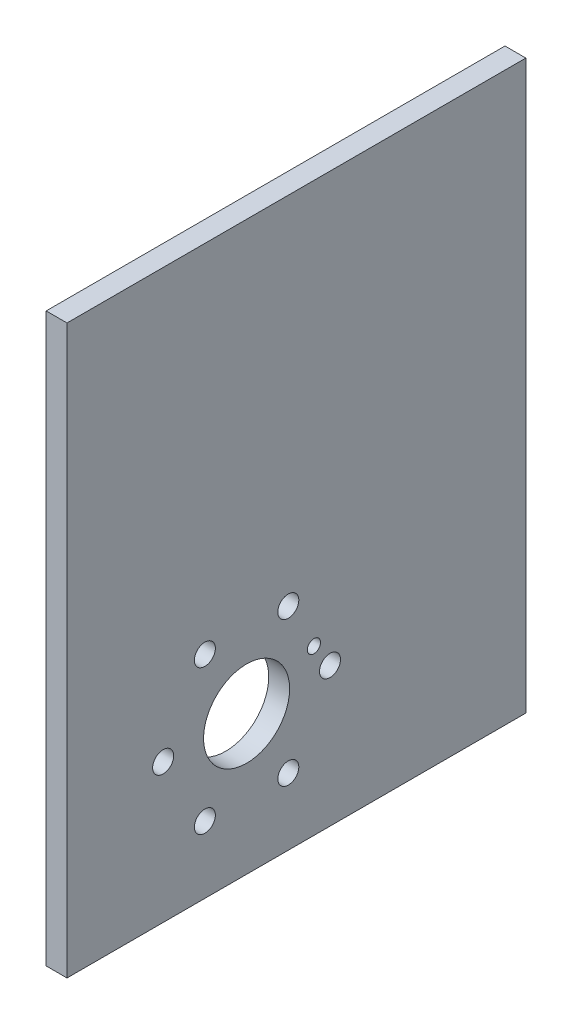
ISO-10303-21;
HEADER;
FILE_DESCRIPTION(('STEP AP214'),'2;1');
FILE_NAME('part.step','',(''),(''),'','','');
FILE_SCHEMA(('AUTOMOTIVE_DESIGN { 1 0 10303 214 1 1 1 1 }'));
ENDSEC;
DATA;
#1=APPLICATION_CONTEXT('core data for automotive mechanical design processes');
#2=APPLICATION_PROTOCOL_DEFINITION('international standard','automotive_design',2000,#1);
#3=PRODUCT_CONTEXT('',#1,'mechanical');
#4=PRODUCT('Part','Part','',(#3));
#5=PRODUCT_RELATED_PRODUCT_CATEGORY('part','',(#4));
#6=PRODUCT_DEFINITION_FORMATION('','',#4);
#7=PRODUCT_DEFINITION_CONTEXT('part definition',#1,'design');
#8=PRODUCT_DEFINITION('design','',#6,#7);
#9=PRODUCT_DEFINITION_SHAPE('','',#8);
#10=(LENGTH_UNIT() NAMED_UNIT(*) SI_UNIT(.MILLI.,.METRE.));
#11=(NAMED_UNIT(*) PLANE_ANGLE_UNIT() SI_UNIT($,.RADIAN.));
#12=(NAMED_UNIT(*) SI_UNIT($,.STERADIAN.) SOLID_ANGLE_UNIT());
#13=UNCERTAINTY_MEASURE_WITH_UNIT(LENGTH_MEASURE(1.E-05),#10,'distance_accuracy_value','');
#14=(GEOMETRIC_REPRESENTATION_CONTEXT(3) GLOBAL_UNCERTAINTY_ASSIGNED_CONTEXT((#13)) GLOBAL_UNIT_ASSIGNED_CONTEXT((#10,
#11,#12)) REPRESENTATION_CONTEXT('',''));
#15=CARTESIAN_POINT('',(0.,0.,0.));
#16=DIRECTION('',(0.,0.,1.));
#17=DIRECTION('',(1.,0.,0.));
#18=AXIS2_PLACEMENT_3D('',#15,#16,#17);
#19=CARTESIAN_POINT('',(3.175,0.,0.));
#20=DIRECTION('',(0.,0.,-1.));
#21=DIRECTION('',(-1.,0.,0.));
#22=AXIS2_PLACEMENT_3D('',#19,#20,#21);
#23=PLANE('',#22);
#24=DIRECTION('',(0.,-1.,0.));
#25=VECTOR('',#24,1.);
#26=CARTESIAN_POINT('',(0.,0.,0.));
#27=LINE('',#26,#25);
#28=CARTESIAN_POINT('',(0.,86.36,0.));
#29=VERTEX_POINT('',#28);
#30=CARTESIAN_POINT('',(0.,0.,0.));
#31=VERTEX_POINT('',#30);
#32=EDGE_CURVE('E96',#29,#31,#27,.T.);
#33=ORIENTED_EDGE('',*,*,#32,.T.);
#34=DIRECTION('',(-1.,0.,0.));
#35=VECTOR('',#34,1.);
#36=CARTESIAN_POINT('',(3.175,0.,0.));
#37=LINE('',#36,#35);
#38=CARTESIAN_POINT('',(3.175,0.,0.));
#39=VERTEX_POINT('',#38);
#40=EDGE_CURVE('E11',#39,#31,#37,.T.);
#41=ORIENTED_EDGE('',*,*,#40,.F.);
#42=DIRECTION('',(0.,-1.,0.));
#43=VECTOR('',#42,1.);
#44=CARTESIAN_POINT('',(3.175,0.,0.));
#45=LINE('',#44,#43);
#46=CARTESIAN_POINT('',(3.175,86.36,0.));
#47=VERTEX_POINT('',#46);
#48=EDGE_CURVE('E84',#47,#39,#45,.T.);
#49=ORIENTED_EDGE('',*,*,#48,.F.);
#50=DIRECTION('',(-1.,0.,0.));
#51=VECTOR('',#50,1.);
#52=CARTESIAN_POINT('',(3.175,86.36,0.));
#53=LINE('',#52,#51);
#54=EDGE_CURVE('E92',#47,#29,#53,.T.);
#55=ORIENTED_EDGE('',*,*,#54,.T.);
#56=EDGE_LOOP('',(#33,#41,#49,#55));
#57=FACE_BOUND('',#56,.T.);
#58=ADVANCED_FACE('F33',(#57),#23,.F.);
#59=CARTESIAN_POINT('',(3.175,0.,0.));
#60=DIRECTION('',(0.,1.,0.));
#61=DIRECTION('',(0.,0.,1.));
#62=AXIS2_PLACEMENT_3D('',#59,#60,#61);
#63=PLANE('',#62);
#64=DIRECTION('',(0.,0.,-1.));
#65=VECTOR('',#64,1.);
#66=CARTESIAN_POINT('',(0.,0.,0.));
#67=LINE('',#66,#65);
#68=CARTESIAN_POINT('',(0.,0.,-69.85));
#69=VERTEX_POINT('',#68);
#70=EDGE_CURVE('E88',#31,#69,#67,.T.);
#71=ORIENTED_EDGE('',*,*,#70,.T.);
#72=DIRECTION('',(-1.,0.,0.));
#73=VECTOR('',#72,1.);
#74=CARTESIAN_POINT('',(3.175,0.,-69.85));
#75=LINE('',#74,#73);
#76=CARTESIAN_POINT('',(3.175,0.,-69.85));
#77=VERTEX_POINT('',#76);
#78=EDGE_CURVE('E41',#77,#69,#75,.T.);
#79=ORIENTED_EDGE('',*,*,#78,.F.);
#80=DIRECTION('',(0.,0.,-1.));
#81=VECTOR('',#80,1.);
#82=CARTESIAN_POINT('',(3.175,0.,0.));
#83=LINE('',#82,#81);
#84=EDGE_CURVE('E79',#39,#77,#83,.T.);
#85=ORIENTED_EDGE('',*,*,#84,.F.);
#86=ORIENTED_EDGE('',*,*,#40,.T.);
#87=EDGE_LOOP('',(#71,#79,#85,#86));
#88=FACE_BOUND('',#87,.T.);
#89=ADVANCED_FACE('F87',(#88),#63,.F.);
#90=CARTESIAN_POINT('',(3.175,0.,-69.85));
#91=DIRECTION('',(0.,0.,1.));
#92=DIRECTION('',(1.,0.,0.));
#93=AXIS2_PLACEMENT_3D('',#90,#91,#92);
#94=PLANE('',#93);
#95=DIRECTION('',(0.,1.,0.));
#96=VECTOR('',#95,1.);
#97=CARTESIAN_POINT('',(0.,0.,-69.85));
#98=LINE('',#97,#96);
#99=CARTESIAN_POINT('',(0.,86.36,-69.85));
#100=VERTEX_POINT('',#99);
#101=EDGE_CURVE('E66',#69,#100,#98,.T.);
#102=ORIENTED_EDGE('',*,*,#101,.T.);
#103=DIRECTION('',(-1.,0.,0.));
#104=VECTOR('',#103,1.);
#105=CARTESIAN_POINT('',(3.175,86.36,-69.85));
#106=LINE('',#105,#104);
#107=CARTESIAN_POINT('',(3.175,86.36,-69.85));
#108=VERTEX_POINT('',#107);
#109=EDGE_CURVE('E89',#108,#100,#106,.T.);
#110=ORIENTED_EDGE('',*,*,#109,.F.);
#111=DIRECTION('',(0.,1.,0.));
#112=VECTOR('',#111,1.);
#113=CARTESIAN_POINT('',(3.175,0.,-69.85));
#114=LINE('',#113,#112);
#115=EDGE_CURVE('E82',#77,#108,#114,.T.);
#116=ORIENTED_EDGE('',*,*,#115,.F.);
#117=ORIENTED_EDGE('',*,*,#78,.T.);
#118=EDGE_LOOP('',(#102,#110,#116,#117));
#119=FACE_BOUND('',#118,.T.);
#120=ADVANCED_FACE('F90',(#119),#94,.F.);
#121=CARTESIAN_POINT('',(3.175,86.36,0.));
#122=DIRECTION('',(0.,-1.,0.));
#123=DIRECTION('',(0.,0.,-1.));
#124=AXIS2_PLACEMENT_3D('',#121,#122,#123);
#125=PLANE('',#124);
#126=DIRECTION('',(0.,0.,1.));
#127=VECTOR('',#126,1.);
#128=CARTESIAN_POINT('',(0.,86.36,0.));
#129=LINE('',#128,#127);
#130=EDGE_CURVE('E72',#100,#29,#129,.T.);
#131=ORIENTED_EDGE('',*,*,#130,.T.);
#132=ORIENTED_EDGE('',*,*,#54,.F.);
#133=DIRECTION('',(0.,0.,1.));
#134=VECTOR('',#133,1.);
#135=CARTESIAN_POINT('',(3.175,86.36,0.));
#136=LINE('',#135,#134);
#137=EDGE_CURVE('E49',#108,#47,#136,.T.);
#138=ORIENTED_EDGE('',*,*,#137,.F.);
#139=ORIENTED_EDGE('',*,*,#109,.T.);
#140=EDGE_LOOP('',(#131,#132,#138,#139));
#141=FACE_BOUND('',#140,.T.);
#142=ADVANCED_FACE('F104',(#141),#125,.F.);
#143=CARTESIAN_POINT('',(3.175,0.,0.));
#144=DIRECTION('',(-1.,0.,0.));
#145=DIRECTION('',(0.,0.,1.));
#146=AXIS2_PLACEMENT_3D('',#143,#144,#145);
#147=PLANE('',#146);
#148=CARTESIAN_POINT('',(3.175,24.95127344,-37.59058776));
#149=DIRECTION('',(1.,0.,0.));
#150=DIRECTION('',(0.,0.,-1.));
#151=AXIS2_PLACEMENT_3D('',#148,#149,#150);
#152=CIRCLE('',#151,0.999999999999997);
#153=CARTESIAN_POINT('',(3.175,24.95127344,-38.59058776));
#154=VERTEX_POINT('',#153);
#155=EDGE_CURVE('E154',#154,#154,#152,.T.);
#156=ORIENTED_EDGE('',*,*,#155,.F.);
#157=EDGE_LOOP('',(#156));
#158=FACE_BOUND('',#157,.T.);
#159=CARTESIAN_POINT('',(3.175,21.18693756,-40.03778886));
#160=DIRECTION('',(-1.,0.,0.));
#161=DIRECTION('',(0.,0.,1.));
#162=AXIS2_PLACEMENT_3D('',#159,#160,#161);
#163=CIRCLE('',#162,1.6);
#164=CARTESIAN_POINT('',(3.175,21.18693756,-38.43778886));
#165=VERTEX_POINT('',#164);
#166=EDGE_CURVE('E145',#165,#165,#163,.T.);
#167=ORIENTED_EDGE('',*,*,#166,.T.);
#168=EDGE_LOOP('',(#167));
#169=FACE_BOUND('',#168,.T.);
#170=CARTESIAN_POINT('',(3.175,32.1854601880624,-33.68778886));
#171=DIRECTION('',(-1.,0.,0.));
#172=DIRECTION('',(0.,0.,1.));
#173=AXIS2_PLACEMENT_3D('',#170,#171,#172);
#174=CIRCLE('',#173,1.59999999999999);
#175=CARTESIAN_POINT('',(3.175,32.1854601880624,-32.08778886));
#176=VERTEX_POINT('',#175);
#177=EDGE_CURVE('E139',#176,#176,#174,.T.);
#178=ORIENTED_EDGE('',*,*,#177,.T.);
#179=EDGE_LOOP('',(#178));
#180=FACE_BOUND('',#179,.T.);
#181=CARTESIAN_POINT('',(3.175,32.1854601880624,-20.98778886));
#182=DIRECTION('',(-1.,0.,0.));
#183=DIRECTION('',(0.,0.,1.));
#184=AXIS2_PLACEMENT_3D('',#181,#182,#183);
#185=CIRCLE('',#184,1.6);
#186=CARTESIAN_POINT('',(3.175,32.1854601880624,-19.38778886));
#187=VERTEX_POINT('',#186);
#188=EDGE_CURVE('E133',#187,#187,#185,.T.);
#189=ORIENTED_EDGE('',*,*,#188,.T.);
#190=EDGE_LOOP('',(#189));
#191=FACE_BOUND('',#190,.T.);
#192=CARTESIAN_POINT('',(3.175,21.1869375599999,-14.63778886));
#193=DIRECTION('',(-1.,0.,0.));
#194=DIRECTION('',(0.,0.,1.));
#195=AXIS2_PLACEMENT_3D('',#192,#193,#194);
#196=CIRCLE('',#195,1.6);
#197=CARTESIAN_POINT('',(3.175,21.1869375599999,-13.03778886));
#198=VERTEX_POINT('',#197);
#199=EDGE_CURVE('E127',#198,#198,#196,.T.);
#200=ORIENTED_EDGE('',*,*,#199,.T.);
#201=EDGE_LOOP('',(#200));
#202=FACE_BOUND('',#201,.T.);
#203=CARTESIAN_POINT('',(3.175,10.1884149319376,-20.9877888600001));
#204=DIRECTION('',(-1.,0.,0.));
#205=DIRECTION('',(0.,0.,1.));
#206=AXIS2_PLACEMENT_3D('',#203,#204,#205);
#207=CIRCLE('',#206,1.6);
#208=CARTESIAN_POINT('',(3.175,10.1884149319376,-19.3877888600001));
#209=VERTEX_POINT('',#208);
#210=EDGE_CURVE('E121',#209,#209,#207,.T.);
#211=ORIENTED_EDGE('',*,*,#210,.T.);
#212=EDGE_LOOP('',(#211));
#213=FACE_BOUND('',#212,.T.);
#214=CARTESIAN_POINT('',(3.175,10.1884149319377,-33.6877888600001));
#215=DIRECTION('',(-1.,0.,0.));
#216=DIRECTION('',(0.,0.,1.));
#217=AXIS2_PLACEMENT_3D('',#214,#215,#216);
#218=CIRCLE('',#217,1.6);
#219=CARTESIAN_POINT('',(3.175,10.1884149319377,-32.0877888600001));
#220=VERTEX_POINT('',#219);
#221=EDGE_CURVE('E115',#220,#220,#218,.T.);
#222=ORIENTED_EDGE('',*,*,#221,.T.);
#223=EDGE_LOOP('',(#222));
#224=FACE_BOUND('',#223,.T.);
#225=CARTESIAN_POINT('',(3.175,21.18693756,-27.33778886));
#226=DIRECTION('',(1.,0.,0.));
#227=DIRECTION('',(0.,0.,-1.));
#228=AXIS2_PLACEMENT_3D('',#225,#226,#227);
#229=CIRCLE('',#228,6.54812);
#230=CARTESIAN_POINT('',(3.175,21.18693756,-33.88590886));
#231=VERTEX_POINT('',#230);
#232=EDGE_CURVE('E112',#231,#231,#229,.T.);
#233=ORIENTED_EDGE('',*,*,#232,.F.);
#234=EDGE_LOOP('',(#233));
#235=FACE_BOUND('',#234,.T.);
#236=ORIENTED_EDGE('',*,*,#48,.T.);
#237=ORIENTED_EDGE('',*,*,#84,.T.);
#238=ORIENTED_EDGE('',*,*,#115,.T.);
#239=ORIENTED_EDGE('',*,*,#137,.T.);
#240=EDGE_LOOP('',(#236,#237,#238,#239));
#241=FACE_BOUND('',#240,.T.);
#242=ADVANCED_FACE('F80',(#158,#169,#180,#191,#202,#213,#224,#235,#241),#147,.F.);
#243=CARTESIAN_POINT('',(0.,0.,0.));
#244=DIRECTION('',(-1.,0.,0.));
#245=DIRECTION('',(0.,0.,1.));
#246=AXIS2_PLACEMENT_3D('',#243,#244,#245);
#247=PLANE('',#246);
#248=CARTESIAN_POINT('',(0.,24.95127344,-37.59058776));
#249=DIRECTION('',(-1.,0.,0.));
#250=DIRECTION('',(0.,0.,1.));
#251=AXIS2_PLACEMENT_3D('',#248,#249,#250);
#252=CIRCLE('',#251,0.999999999999996);
#253=CARTESIAN_POINT('',(0.,24.95127344,-36.59058776));
#254=VERTEX_POINT('',#253);
#255=EDGE_CURVE('E151',#254,#254,#252,.T.);
#256=ORIENTED_EDGE('',*,*,#255,.F.);
#257=EDGE_LOOP('',(#256));
#258=FACE_BOUND('',#257,.T.);
#259=CARTESIAN_POINT('',(0.,21.18693756,-40.03778886));
#260=DIRECTION('',(-1.,0.,0.));
#261=DIRECTION('',(0.,0.,1.));
#262=AXIS2_PLACEMENT_3D('',#259,#260,#261);
#263=CIRCLE('',#262,1.6);
#264=CARTESIAN_POINT('',(0.,21.18693756,-38.43778886));
#265=VERTEX_POINT('',#264);
#266=EDGE_CURVE('E148',#265,#265,#263,.T.);
#267=ORIENTED_EDGE('',*,*,#266,.F.);
#268=EDGE_LOOP('',(#267));
#269=FACE_BOUND('',#268,.T.);
#270=CARTESIAN_POINT('',(0.,32.1854601880624,-33.68778886));
#271=DIRECTION('',(-1.,0.,0.));
#272=DIRECTION('',(0.,0.,1.));
#273=AXIS2_PLACEMENT_3D('',#270,#271,#272);
#274=CIRCLE('',#273,1.6);
#275=CARTESIAN_POINT('',(0.,32.1854601880624,-32.08778886));
#276=VERTEX_POINT('',#275);
#277=EDGE_CURVE('E142',#276,#276,#274,.T.);
#278=ORIENTED_EDGE('',*,*,#277,.F.);
#279=EDGE_LOOP('',(#278));
#280=FACE_BOUND('',#279,.T.);
#281=CARTESIAN_POINT('',(0.,32.1854601880624,-20.98778886));
#282=DIRECTION('',(-1.,0.,0.));
#283=DIRECTION('',(0.,0.,1.));
#284=AXIS2_PLACEMENT_3D('',#281,#282,#283);
#285=CIRCLE('',#284,1.6);
#286=CARTESIAN_POINT('',(0.,32.1854601880624,-19.38778886));
#287=VERTEX_POINT('',#286);
#288=EDGE_CURVE('E136',#287,#287,#285,.T.);
#289=ORIENTED_EDGE('',*,*,#288,.F.);
#290=EDGE_LOOP('',(#289));
#291=FACE_BOUND('',#290,.T.);
#292=CARTESIAN_POINT('',(0.,21.1869375599999,-14.63778886));
#293=DIRECTION('',(-1.,0.,0.));
#294=DIRECTION('',(0.,0.,1.));
#295=AXIS2_PLACEMENT_3D('',#292,#293,#294);
#296=CIRCLE('',#295,1.6);
#297=CARTESIAN_POINT('',(0.,21.1869375599999,-13.03778886));
#298=VERTEX_POINT('',#297);
#299=EDGE_CURVE('E130',#298,#298,#296,.T.);
#300=ORIENTED_EDGE('',*,*,#299,.F.);
#301=EDGE_LOOP('',(#300));
#302=FACE_BOUND('',#301,.T.);
#303=CARTESIAN_POINT('',(0.,10.1884149319376,-20.9877888600001));
#304=DIRECTION('',(-1.,0.,0.));
#305=DIRECTION('',(0.,0.,1.));
#306=AXIS2_PLACEMENT_3D('',#303,#304,#305);
#307=CIRCLE('',#306,1.6);
#308=CARTESIAN_POINT('',(0.,10.1884149319376,-19.3877888600001));
#309=VERTEX_POINT('',#308);
#310=EDGE_CURVE('E124',#309,#309,#307,.T.);
#311=ORIENTED_EDGE('',*,*,#310,.F.);
#312=EDGE_LOOP('',(#311));
#313=FACE_BOUND('',#312,.T.);
#314=CARTESIAN_POINT('',(0.,10.1884149319377,-33.6877888600001));
#315=DIRECTION('',(-1.,0.,0.));
#316=DIRECTION('',(0.,0.,1.));
#317=AXIS2_PLACEMENT_3D('',#314,#315,#316);
#318=CIRCLE('',#317,1.6);
#319=CARTESIAN_POINT('',(0.,10.1884149319377,-32.0877888600001));
#320=VERTEX_POINT('',#319);
#321=EDGE_CURVE('E118',#320,#320,#318,.T.);
#322=ORIENTED_EDGE('',*,*,#321,.F.);
#323=EDGE_LOOP('',(#322));
#324=FACE_BOUND('',#323,.T.);
#325=CARTESIAN_POINT('',(0.,21.18693756,-27.33778886));
#326=DIRECTION('',(-1.,0.,0.));
#327=DIRECTION('',(0.,0.,1.));
#328=AXIS2_PLACEMENT_3D('',#325,#326,#327);
#329=CIRCLE('',#328,6.54812);
#330=CARTESIAN_POINT('',(0.,21.18693756,-20.78966886));
#331=VERTEX_POINT('',#330);
#332=EDGE_CURVE('E99',#331,#331,#329,.T.);
#333=ORIENTED_EDGE('',*,*,#332,.F.);
#334=EDGE_LOOP('',(#333));
#335=FACE_BOUND('',#334,.T.);
#336=ORIENTED_EDGE('',*,*,#32,.F.);
#337=ORIENTED_EDGE('',*,*,#130,.F.);
#338=ORIENTED_EDGE('',*,*,#101,.F.);
#339=ORIENTED_EDGE('',*,*,#70,.F.);
#340=EDGE_LOOP('',(#336,#337,#338,#339));
#341=FACE_BOUND('',#340,.T.);
#342=ADVANCED_FACE('F107',(#258,#269,#280,#291,#302,#313,#324,#335,#341),#247,.T.);
#343=CARTESIAN_POINT('',(3.175,21.18693756,-27.33778886));
#344=DIRECTION('',(1.,0.,0.));
#345=DIRECTION('',(0.,0.,-1.));
#346=AXIS2_PLACEMENT_3D('',#343,#344,#345);
#347=CYLINDRICAL_SURFACE('',#346,6.54812);
#348=ORIENTED_EDGE('',*,*,#332,.T.);
#349=EDGE_LOOP('',(#348));
#350=FACE_BOUND('',#349,.T.);
#351=ORIENTED_EDGE('',*,*,#232,.T.);
#352=EDGE_LOOP('',(#351));
#353=FACE_BOUND('',#352,.T.);
#354=ADVANCED_FACE('F177',(#350,#353),#347,.F.);
#355=CARTESIAN_POINT('',(0.,10.1884149319377,-33.6877888600001));
#356=DIRECTION('',(-1.,0.,0.));
#357=DIRECTION('',(0.,0.,1.));
#358=AXIS2_PLACEMENT_3D('',#355,#356,#357);
#359=CYLINDRICAL_SURFACE('',#358,1.6);
#360=ORIENTED_EDGE('',*,*,#321,.T.);
#361=EDGE_LOOP('',(#360));
#362=FACE_BOUND('',#361,.T.);
#363=ORIENTED_EDGE('',*,*,#221,.F.);
#364=EDGE_LOOP('',(#363));
#365=FACE_BOUND('',#364,.T.);
#366=ADVANCED_FACE('F179',(#362,#365),#359,.F.);
#367=CARTESIAN_POINT('',(0.,10.1884149319376,-20.9877888600001));
#368=DIRECTION('',(-1.,0.,0.));
#369=DIRECTION('',(0.,0.,1.));
#370=AXIS2_PLACEMENT_3D('',#367,#368,#369);
#371=CYLINDRICAL_SURFACE('',#370,1.6);
#372=ORIENTED_EDGE('',*,*,#310,.T.);
#373=EDGE_LOOP('',(#372));
#374=FACE_BOUND('',#373,.T.);
#375=ORIENTED_EDGE('',*,*,#210,.F.);
#376=EDGE_LOOP('',(#375));
#377=FACE_BOUND('',#376,.T.);
#378=ADVANCED_FACE('F186',(#374,#377),#371,.F.);
#379=CARTESIAN_POINT('',(0.,21.1869375599999,-14.63778886));
#380=DIRECTION('',(-1.,0.,0.));
#381=DIRECTION('',(0.,0.,1.));
#382=AXIS2_PLACEMENT_3D('',#379,#380,#381);
#383=CYLINDRICAL_SURFACE('',#382,1.6);
#384=ORIENTED_EDGE('',*,*,#299,.T.);
#385=EDGE_LOOP('',(#384));
#386=FACE_BOUND('',#385,.T.);
#387=ORIENTED_EDGE('',*,*,#199,.F.);
#388=EDGE_LOOP('',(#387));
#389=FACE_BOUND('',#388,.T.);
#390=ADVANCED_FACE('F248',(#386,#389),#383,.F.);
#391=CARTESIAN_POINT('',(0.,32.1854601880624,-20.98778886));
#392=DIRECTION('',(-1.,0.,0.));
#393=DIRECTION('',(0.,0.,1.));
#394=AXIS2_PLACEMENT_3D('',#391,#392,#393);
#395=CYLINDRICAL_SURFACE('',#394,1.6);
#396=ORIENTED_EDGE('',*,*,#288,.T.);
#397=EDGE_LOOP('',(#396));
#398=FACE_BOUND('',#397,.T.);
#399=ORIENTED_EDGE('',*,*,#188,.F.);
#400=EDGE_LOOP('',(#399));
#401=FACE_BOUND('',#400,.T.);
#402=ADVANCED_FACE('F240',(#398,#401),#395,.F.);
#403=CARTESIAN_POINT('',(0.,32.1854601880624,-33.68778886));
#404=DIRECTION('',(-1.,0.,0.));
#405=DIRECTION('',(0.,0.,1.));
#406=AXIS2_PLACEMENT_3D('',#403,#404,#405);
#407=CYLINDRICAL_SURFACE('',#406,1.59999999999999);
#408=ORIENTED_EDGE('',*,*,#277,.T.);
#409=EDGE_LOOP('',(#408));
#410=FACE_BOUND('',#409,.T.);
#411=ORIENTED_EDGE('',*,*,#177,.F.);
#412=EDGE_LOOP('',(#411));
#413=FACE_BOUND('',#412,.T.);
#414=ADVANCED_FACE('F233',(#410,#413),#407,.F.);
#415=CARTESIAN_POINT('',(0.,21.18693756,-40.03778886));
#416=DIRECTION('',(-1.,0.,0.));
#417=DIRECTION('',(0.,0.,1.));
#418=AXIS2_PLACEMENT_3D('',#415,#416,#417);
#419=CYLINDRICAL_SURFACE('',#418,1.6);
#420=ORIENTED_EDGE('',*,*,#266,.T.);
#421=EDGE_LOOP('',(#420));
#422=FACE_BOUND('',#421,.T.);
#423=ORIENTED_EDGE('',*,*,#166,.F.);
#424=EDGE_LOOP('',(#423));
#425=FACE_BOUND('',#424,.T.);
#426=ADVANCED_FACE('F223',(#422,#425),#419,.F.);
#427=CARTESIAN_POINT('',(3.175,24.95127344,-37.59058776));
#428=DIRECTION('',(1.,0.,0.));
#429=DIRECTION('',(0.,0.,-1.));
#430=AXIS2_PLACEMENT_3D('',#427,#428,#429);
#431=CYLINDRICAL_SURFACE('',#430,0.999999999999996);
#432=ORIENTED_EDGE('',*,*,#255,.T.);
#433=EDGE_LOOP('',(#432));
#434=FACE_BOUND('',#433,.T.);
#435=ORIENTED_EDGE('',*,*,#155,.T.);
#436=EDGE_LOOP('',(#435));
#437=FACE_BOUND('',#436,.T.);
#438=ADVANCED_FACE('F158',(#434,#437),#431,.F.);
#439=CLOSED_SHELL('',(#58,#89,#120,#142,#242,#342,#354,#366,#378,#390,#402,#414,#426,#438));
#440=MANIFOLD_SOLID_BREP('B2',#439);
#441=ADVANCED_BREP_SHAPE_REPRESENTATION('',(#18,#440),#14);
#442=SHAPE_DEFINITION_REPRESENTATION(#9,#441);
ENDSEC;
END-ISO-10303-21;
